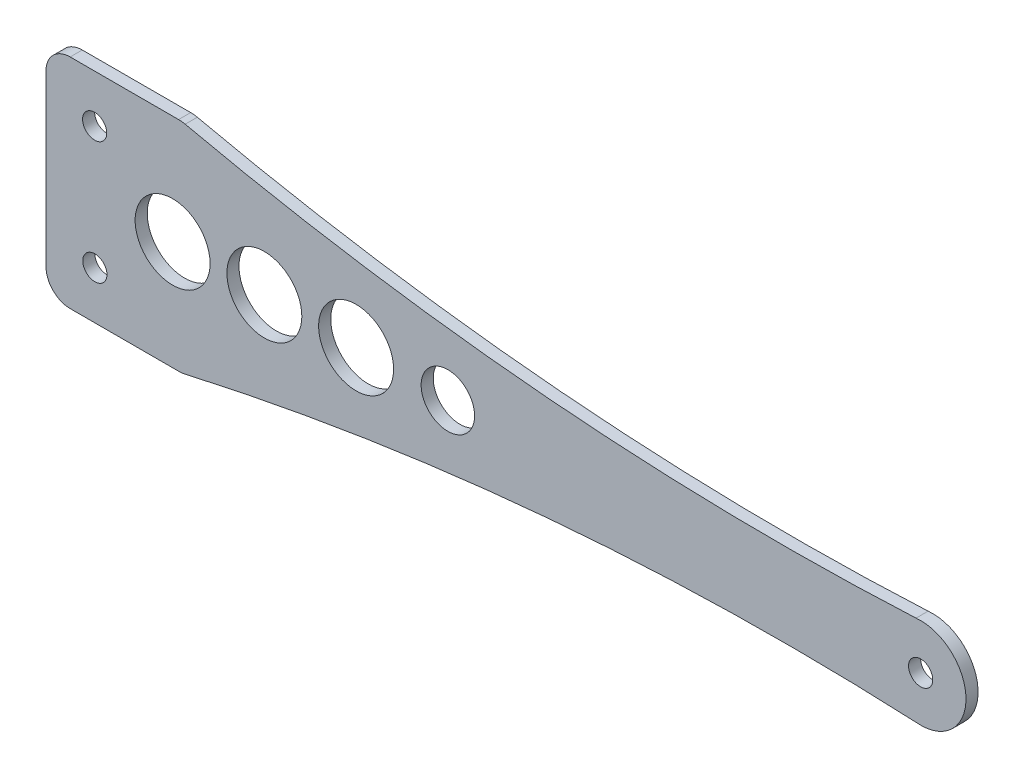
ISO-10303-21;
HEADER;
FILE_DESCRIPTION(('STEP AP214'),'2;1');
FILE_NAME('part.step','',(''),(''),'','','');
FILE_SCHEMA(('AUTOMOTIVE_DESIGN { 1 0 10303 214 1 1 1 1 }'));
ENDSEC;
DATA;
#1=APPLICATION_CONTEXT('core data for automotive mechanical design processes');
#2=APPLICATION_PROTOCOL_DEFINITION('international standard','automotive_design',2000,#1);
#3=PRODUCT_CONTEXT('',#1,'mechanical');
#4=PRODUCT('Part','Part','',(#3));
#5=PRODUCT_RELATED_PRODUCT_CATEGORY('part','',(#4));
#6=PRODUCT_DEFINITION_FORMATION('','',#4);
#7=PRODUCT_DEFINITION_CONTEXT('part definition',#1,'design');
#8=PRODUCT_DEFINITION('design','',#6,#7);
#9=PRODUCT_DEFINITION_SHAPE('','',#8);
#10=(LENGTH_UNIT() NAMED_UNIT(*) SI_UNIT(.MILLI.,.METRE.));
#11=(NAMED_UNIT(*) PLANE_ANGLE_UNIT() SI_UNIT($,.RADIAN.));
#12=(NAMED_UNIT(*) SI_UNIT($,.STERADIAN.) SOLID_ANGLE_UNIT());
#13=UNCERTAINTY_MEASURE_WITH_UNIT(LENGTH_MEASURE(1.E-05),#10,'distance_accuracy_value','');
#14=(GEOMETRIC_REPRESENTATION_CONTEXT(3) GLOBAL_UNCERTAINTY_ASSIGNED_CONTEXT((#13)) GLOBAL_UNIT_ASSIGNED_CONTEXT((#10,
#11,#12)) REPRESENTATION_CONTEXT('',''));
#15=CARTESIAN_POINT('',(0.,0.,0.));
#16=DIRECTION('',(0.,0.,1.));
#17=DIRECTION('',(1.,0.,0.));
#18=AXIS2_PLACEMENT_3D('',#15,#16,#17);
#19=CARTESIAN_POINT('',(2268.27785057398,1591.16171773863,2.));
#20=DIRECTION('',(0.,0.,1.));
#21=DIRECTION('',(1.,0.,0.));
#22=AXIS2_PLACEMENT_3D('',#19,#20,#21);
#23=PLANE('',#22);
#24=CARTESIAN_POINT('',(2315.57006356653,1577.17432215257,2.));
#25=DIRECTION('',(0.,0.,1.));
#26=DIRECTION('',(1.,0.,0.));
#27=AXIS2_PLACEMENT_3D('',#24,#25,#26);
#28=CIRCLE('',#27,6.19827488197444);
#29=CARTESIAN_POINT('',(2321.7683384485,1577.17432215257,2.));
#30=VERTEX_POINT('',#29);
#31=EDGE_CURVE('E235',#30,#30,#28,.T.);
#32=ORIENTED_EDGE('',*,*,#31,.F.);
#33=EDGE_LOOP('',(#32));
#34=FACE_BOUND('',#33,.T.);
#35=CARTESIAN_POINT('',(2285.21897073178,1577.14245303134,2.));
#36=DIRECTION('',(0.,0.,1.));
#37=DIRECTION('',(1.,0.,0.));
#38=AXIS2_PLACEMENT_3D('',#35,#36,#37);
#39=CIRCLE('',#38,6.19827488197444);
#40=CARTESIAN_POINT('',(2291.41724561376,1577.14245303134,2.));
#41=VERTEX_POINT('',#40);
#42=EDGE_CURVE('E223',#41,#41,#39,.T.);
#43=ORIENTED_EDGE('',*,*,#42,.F.);
#44=EDGE_LOOP('',(#43));
#45=FACE_BOUND('',#44,.T.);
#46=CARTESIAN_POINT('',(2408.94422753866,1577.27236648222,2.));
#47=DIRECTION('',(0.,0.,1.));
#48=DIRECTION('',(1.,0.,0.));
#49=AXIS2_PLACEMENT_3D('',#46,#47,#48);
#50=CIRCLE('',#49,1.99999999999978);
#51=CARTESIAN_POINT('',(2410.94422753866,1577.27236648222,2.));
#52=VERTEX_POINT('',#51);
#53=EDGE_CURVE('E211',#52,#52,#50,.T.);
#54=ORIENTED_EDGE('',*,*,#53,.F.);
#55=EDGE_LOOP('',(#54));
#56=FACE_BOUND('',#55,.T.);
#57=CARTESIAN_POINT('',(2268.27785057398,1591.16171773863,2.));
#58=DIRECTION('',(0.,0.,1.));
#59=DIRECTION('',(1.,0.,0.));
#60=AXIS2_PLACEMENT_3D('',#57,#58,#59);
#61=CIRCLE('',#60,4.00000000000023);
#62=CARTESIAN_POINT('',(2268.27785057398,1595.16171773863,2.));
#63=VERTEX_POINT('',#62);
#64=CARTESIAN_POINT('',(2264.27785057398,1591.16171773863,2.));
#65=VERTEX_POINT('',#64);
#66=EDGE_CURVE('E160',#63,#65,#61,.T.);
#67=ORIENTED_EDGE('',*,*,#66,.T.);
#68=DIRECTION('',(0.,-1.,0.));
#69=VECTOR('',#68,1.);
#70=CARTESIAN_POINT('',(2264.27785057398,1591.16171773863,2.));
#71=LINE('',#70,#69);
#72=CARTESIAN_POINT('',(2264.27785057398,1563.11291185545,2.));
#73=VERTEX_POINT('',#72);
#74=EDGE_CURVE('E98',#65,#73,#71,.T.);
#75=ORIENTED_EDGE('',*,*,#74,.T.);
#76=CARTESIAN_POINT('',(2268.27785057398,1563.11291185545,2.));
#77=DIRECTION('',(0.,0.,1.));
#78=DIRECTION('',(1.,0.,0.));
#79=AXIS2_PLACEMENT_3D('',#76,#77,#78);
#80=CIRCLE('',#79,4.);
#81=CARTESIAN_POINT('',(2268.27785057398,1559.11291185545,2.));
#82=VERTEX_POINT('',#81);
#83=EDGE_CURVE('E181',#73,#82,#80,.T.);
#84=ORIENTED_EDGE('',*,*,#83,.T.);
#85=DIRECTION('',(1.,0.,0.));
#86=VECTOR('',#85,1.);
#87=CARTESIAN_POINT('',(2268.27785057398,1559.11291185545,2.));
#88=LINE('',#87,#86);
#89=CARTESIAN_POINT('',(2286.18213001002,1559.11291185546,2.));
#90=VERTEX_POINT('',#89);
#91=EDGE_CURVE('E200',#82,#90,#88,.T.);
#92=ORIENTED_EDGE('',*,*,#91,.T.);
#93=CARTESIAN_POINT('',(2286.18213001002,1564.11291185546,2.));
#94=DIRECTION('',(0.,0.,1.));
#95=DIRECTION('',(1.,0.,0.));
#96=AXIS2_PLACEMENT_3D('',#93,#94,#95);
#97=CIRCLE('',#96,4.99999999999987);
#98=CARTESIAN_POINT('',(2287.28476918928,1559.23600844854,2.));
#99=VERTEX_POINT('',#98);
#100=EDGE_CURVE('E197',#90,#99,#97,.T.);
#101=ORIENTED_EDGE('',*,*,#100,.T.);
#102=CARTESIAN_POINT('',(2386.62657166681,1119.85349409846,2.));
#103=DIRECTION('',(0.,0.,-1.));
#104=DIRECTION('',(1.,0.,0.));
#105=AXIS2_PLACEMENT_3D('',#102,#103,#104);
#106=CIRCLE('',#105,450.472848944398);
#107=CARTESIAN_POINT('',(2408.19843558947,1569.80953897728,2.));
#108=VERTEX_POINT('',#107);
#109=EDGE_CURVE('E199',#99,#108,#106,.T.);
#110=ORIENTED_EDGE('',*,*,#109,.T.);
#111=CARTESIAN_POINT('',(2408.94422753866,1577.27236648222,2.));
#112=DIRECTION('',(0.,0.,1.));
#113=DIRECTION('',(1.,0.,0.));
#114=AXIS2_PLACEMENT_3D('',#111,#112,#113);
#115=CIRCLE('',#114,7.49999999999993);
#116=CARTESIAN_POINT('',(2408.18276508053,1584.73361134651,2.));
#117=VERTEX_POINT('',#116);
#118=EDGE_CURVE('E123',#108,#117,#115,.T.);
#119=ORIENTED_EDGE('',*,*,#118,.T.);
#120=CARTESIAN_POINT('',(2385.666028026,2034.64336250611,2.));
#121=DIRECTION('',(0.,0.,-1.));
#122=DIRECTION('',(1.,0.,0.));
#123=AXIS2_PLACEMENT_3D('',#120,#121,#122);
#124=CIRCLE('',#123,450.472848944398);
#125=CARTESIAN_POINT('',(2287.30138065483,1595.04106066543,2.));
#126=VERTEX_POINT('',#125);
#127=EDGE_CURVE('E117',#117,#126,#124,.T.);
#128=ORIENTED_EDGE('',*,*,#127,.T.);
#129=CARTESIAN_POINT('',(2286.20958735812,1590.16171773864,2.));
#130=DIRECTION('',(0.,0.,1.));
#131=DIRECTION('',(1.,0.,0.));
#132=AXIS2_PLACEMENT_3D('',#129,#130,#131);
#133=CIRCLE('',#132,4.99999999999987);
#134=CARTESIAN_POINT('',(2286.20958735812,1595.16171773864,2.));
#135=VERTEX_POINT('',#134);
#136=EDGE_CURVE('E121',#126,#135,#133,.T.);
#137=ORIENTED_EDGE('',*,*,#136,.T.);
#138=DIRECTION('',(-1.,0.,0.));
#139=VECTOR('',#138,1.);
#140=CARTESIAN_POINT('',(2268.27785057398,1595.16171773863,2.));
#141=LINE('',#140,#139);
#142=EDGE_CURVE('E49',#135,#63,#141,.T.);
#143=ORIENTED_EDGE('',*,*,#142,.T.);
#144=EDGE_LOOP('',(#67,#75,#84,#92,#101,#110,#119,#128,#137,#143));
#145=FACE_BOUND('',#144,.T.);
#146=CARTESIAN_POINT('',(2272.32548700573,1587.26517494694,2.));
#147=DIRECTION('',(0.,0.,1.));
#148=DIRECTION('',(1.,0.,0.));
#149=AXIS2_PLACEMENT_3D('',#146,#147,#148);
#150=CIRCLE('',#149,1.99999999999978);
#151=CARTESIAN_POINT('',(2274.32548700573,1587.26517494694,2.));
#152=VERTEX_POINT('',#151);
#153=EDGE_CURVE('E145',#152,#152,#150,.T.);
#154=ORIENTED_EDGE('',*,*,#153,.F.);
#155=EDGE_LOOP('',(#154));
#156=FACE_BOUND('',#155,.T.);
#157=CARTESIAN_POINT('',(2272.36052271664,1567.00968004048,2.));
#158=DIRECTION('',(0.,0.,1.));
#159=DIRECTION('',(1.,0.,0.));
#160=AXIS2_PLACEMENT_3D('',#157,#158,#159);
#161=CIRCLE('',#160,1.99999999999978);
#162=CARTESIAN_POINT('',(2274.36052271664,1567.00968004048,2.));
#163=VERTEX_POINT('',#162);
#164=EDGE_CURVE('E217',#163,#163,#161,.T.);
#165=ORIENTED_EDGE('',*,*,#164,.F.);
#166=EDGE_LOOP('',(#165));
#167=FACE_BOUND('',#166,.T.);
#168=CARTESIAN_POINT('',(2300.39451714915,1577.15838759195,2.));
#169=DIRECTION('',(0.,0.,1.));
#170=DIRECTION('',(1.,0.,0.));
#171=AXIS2_PLACEMENT_3D('',#168,#169,#170);
#172=CIRCLE('',#171,6.19827488197444);
#173=CARTESIAN_POINT('',(2306.59279203113,1577.15838759195,2.));
#174=VERTEX_POINT('',#173);
#175=EDGE_CURVE('E229',#174,#174,#172,.T.);
#176=ORIENTED_EDGE('',*,*,#175,.F.);
#177=EDGE_LOOP('',(#176));
#178=FACE_BOUND('',#177,.T.);
#179=CARTESIAN_POINT('',(2330.7456099839,1577.19025671318,2.));
#180=DIRECTION('',(0.,0.,1.));
#181=DIRECTION('',(1.,0.,0.));
#182=AXIS2_PLACEMENT_3D('',#179,#180,#181);
#183=CIRCLE('',#182,4.41971780266748);
#184=CARTESIAN_POINT('',(2335.16532778656,1577.19025671318,2.));
#185=VERTEX_POINT('',#184);
#186=EDGE_CURVE('E241',#185,#185,#183,.T.);
#187=ORIENTED_EDGE('',*,*,#186,.F.);
#188=EDGE_LOOP('',(#187));
#189=FACE_BOUND('',#188,.T.);
#190=ADVANCED_FACE('F32',(#34,#45,#56,#145,#156,#167,#178,#189),#23,.T.);
#191=CARTESIAN_POINT('',(2268.27785057398,1591.16171773863,0.));
#192=DIRECTION('',(0.,0.,1.));
#193=DIRECTION('',(1.,0.,0.));
#194=AXIS2_PLACEMENT_3D('',#191,#192,#193);
#195=PLANE('',#194);
#196=CARTESIAN_POINT('',(2315.57006356653,1577.17432215257,0.));
#197=DIRECTION('',(0.,0.,1.));
#198=DIRECTION('',(1.,0.,0.));
#199=AXIS2_PLACEMENT_3D('',#196,#197,#198);
#200=CIRCLE('',#199,6.19827488197444);
#201=CARTESIAN_POINT('',(2321.7683384485,1577.17432215257,0.));
#202=VERTEX_POINT('',#201);
#203=EDGE_CURVE('E238',#202,#202,#200,.T.);
#204=ORIENTED_EDGE('',*,*,#203,.T.);
#205=EDGE_LOOP('',(#204));
#206=FACE_BOUND('',#205,.T.);
#207=CARTESIAN_POINT('',(2285.21897073178,1577.14245303134,0.));
#208=DIRECTION('',(0.,0.,1.));
#209=DIRECTION('',(1.,0.,0.));
#210=AXIS2_PLACEMENT_3D('',#207,#208,#209);
#211=CIRCLE('',#210,6.19827488197444);
#212=CARTESIAN_POINT('',(2291.41724561376,1577.14245303134,0.));
#213=VERTEX_POINT('',#212);
#214=EDGE_CURVE('E226',#213,#213,#211,.T.);
#215=ORIENTED_EDGE('',*,*,#214,.T.);
#216=EDGE_LOOP('',(#215));
#217=FACE_BOUND('',#216,.T.);
#218=CARTESIAN_POINT('',(2408.94422753866,1577.27236648222,0.));
#219=DIRECTION('',(0.,0.,1.));
#220=DIRECTION('',(1.,0.,0.));
#221=AXIS2_PLACEMENT_3D('',#218,#219,#220);
#222=CIRCLE('',#221,1.99999999999978);
#223=CARTESIAN_POINT('',(2410.94422753866,1577.27236648222,0.));
#224=VERTEX_POINT('',#223);
#225=EDGE_CURVE('E214',#224,#224,#222,.T.);
#226=ORIENTED_EDGE('',*,*,#225,.T.);
#227=EDGE_LOOP('',(#226));
#228=FACE_BOUND('',#227,.T.);
#229=CARTESIAN_POINT('',(2268.27785057398,1591.16171773863,0.));
#230=DIRECTION('',(0.,0.,1.));
#231=DIRECTION('',(1.,0.,0.));
#232=AXIS2_PLACEMENT_3D('',#229,#230,#231);
#233=CIRCLE('',#232,4.00000000000023);
#234=CARTESIAN_POINT('',(2268.27785057398,1595.16171773863,0.));
#235=VERTEX_POINT('',#234);
#236=CARTESIAN_POINT('',(2264.27785057398,1591.16171773863,0.));
#237=VERTEX_POINT('',#236);
#238=EDGE_CURVE('E141',#235,#237,#233,.T.);
#239=ORIENTED_EDGE('',*,*,#238,.F.);
#240=DIRECTION('',(-1.,0.,0.));
#241=VECTOR('',#240,1.);
#242=CARTESIAN_POINT('',(2268.27785057398,1595.16171773863,0.));
#243=LINE('',#242,#241);
#244=CARTESIAN_POINT('',(2286.20958735812,1595.16171773864,0.));
#245=VERTEX_POINT('',#244);
#246=EDGE_CURVE('E90',#245,#235,#243,.T.);
#247=ORIENTED_EDGE('',*,*,#246,.F.);
#248=CARTESIAN_POINT('',(2286.20958735812,1590.16171773864,0.));
#249=DIRECTION('',(0.,0.,1.));
#250=DIRECTION('',(1.,0.,0.));
#251=AXIS2_PLACEMENT_3D('',#248,#249,#250);
#252=CIRCLE('',#251,4.99999999999987);
#253=CARTESIAN_POINT('',(2287.30138065483,1595.04106066543,0.));
#254=VERTEX_POINT('',#253);
#255=EDGE_CURVE('E84',#254,#245,#252,.T.);
#256=ORIENTED_EDGE('',*,*,#255,.F.);
#257=CARTESIAN_POINT('',(2385.666028026,2034.64336250611,0.));
#258=DIRECTION('',(0.,0.,-1.));
#259=DIRECTION('',(1.,0.,0.));
#260=AXIS2_PLACEMENT_3D('',#257,#258,#259);
#261=CIRCLE('',#260,450.472848944398);
#262=CARTESIAN_POINT('',(2408.18276508053,1584.73361134651,0.));
#263=VERTEX_POINT('',#262);
#264=EDGE_CURVE('E131',#263,#254,#261,.T.);
#265=ORIENTED_EDGE('',*,*,#264,.F.);
#266=CARTESIAN_POINT('',(2408.94422753866,1577.27236648222,0.));
#267=DIRECTION('',(0.,0.,1.));
#268=DIRECTION('',(1.,0.,0.));
#269=AXIS2_PLACEMENT_3D('',#266,#267,#268);
#270=CIRCLE('',#269,7.49999999999993);
#271=CARTESIAN_POINT('',(2408.19843558947,1569.80953897728,0.));
#272=VERTEX_POINT('',#271);
#273=EDGE_CURVE('E155',#272,#263,#270,.T.);
#274=ORIENTED_EDGE('',*,*,#273,.F.);
#275=CARTESIAN_POINT('',(2386.62657166681,1119.85349409846,0.));
#276=DIRECTION('',(0.,0.,-1.));
#277=DIRECTION('',(1.,0.,0.));
#278=AXIS2_PLACEMENT_3D('',#275,#276,#277);
#279=CIRCLE('',#278,450.472848944398);
#280=CARTESIAN_POINT('',(2287.28476918928,1559.23600844854,0.));
#281=VERTEX_POINT('',#280);
#282=EDGE_CURVE('E153',#281,#272,#279,.T.);
#283=ORIENTED_EDGE('',*,*,#282,.F.);
#284=CARTESIAN_POINT('',(2286.18213001002,1564.11291185546,0.));
#285=DIRECTION('',(0.,0.,1.));
#286=DIRECTION('',(1.,0.,0.));
#287=AXIS2_PLACEMENT_3D('',#284,#285,#286);
#288=CIRCLE('',#287,4.99999999999987);
#289=CARTESIAN_POINT('',(2286.18213001002,1559.11291185546,0.));
#290=VERTEX_POINT('',#289);
#291=EDGE_CURVE('E151',#290,#281,#288,.T.);
#292=ORIENTED_EDGE('',*,*,#291,.F.);
#293=DIRECTION('',(1.,0.,0.));
#294=VECTOR('',#293,1.);
#295=CARTESIAN_POINT('',(2268.27785057398,1559.11291185545,0.));
#296=LINE('',#295,#294);
#297=CARTESIAN_POINT('',(2268.27785057398,1559.11291185545,0.));
#298=VERTEX_POINT('',#297);
#299=EDGE_CURVE('E149',#298,#290,#296,.T.);
#300=ORIENTED_EDGE('',*,*,#299,.F.);
#301=CARTESIAN_POINT('',(2268.27785057398,1563.11291185545,0.));
#302=DIRECTION('',(0.,0.,1.));
#303=DIRECTION('',(1.,0.,0.));
#304=AXIS2_PLACEMENT_3D('',#301,#302,#303);
#305=CIRCLE('',#304,4.);
#306=CARTESIAN_POINT('',(2264.27785057398,1563.11291185545,0.));
#307=VERTEX_POINT('',#306);
#308=EDGE_CURVE('E147',#307,#298,#305,.T.);
#309=ORIENTED_EDGE('',*,*,#308,.F.);
#310=DIRECTION('',(0.,-1.,0.));
#311=VECTOR('',#310,1.);
#312=CARTESIAN_POINT('',(2264.27785057398,1591.16171773863,0.));
#313=LINE('',#312,#311);
#314=EDGE_CURVE('E144',#237,#307,#313,.T.);
#315=ORIENTED_EDGE('',*,*,#314,.F.);
#316=EDGE_LOOP('',(#239,#247,#256,#265,#274,#283,#292,#300,#309,#315));
#317=FACE_BOUND('',#316,.T.);
#318=CARTESIAN_POINT('',(2272.32548700573,1587.26517494694,0.));
#319=DIRECTION('',(0.,0.,1.));
#320=DIRECTION('',(1.,0.,0.));
#321=AXIS2_PLACEMENT_3D('',#318,#319,#320);
#322=CIRCLE('',#321,1.99999999999978);
#323=CARTESIAN_POINT('',(2274.32548700573,1587.26517494694,0.));
#324=VERTEX_POINT('',#323);
#325=EDGE_CURVE('E208',#324,#324,#322,.T.);
#326=ORIENTED_EDGE('',*,*,#325,.T.);
#327=EDGE_LOOP('',(#326));
#328=FACE_BOUND('',#327,.T.);
#329=CARTESIAN_POINT('',(2272.36052271664,1567.00968004048,0.));
#330=DIRECTION('',(0.,0.,1.));
#331=DIRECTION('',(1.,0.,0.));
#332=AXIS2_PLACEMENT_3D('',#329,#330,#331);
#333=CIRCLE('',#332,1.99999999999978);
#334=CARTESIAN_POINT('',(2274.36052271664,1567.00968004048,0.));
#335=VERTEX_POINT('',#334);
#336=EDGE_CURVE('E220',#335,#335,#333,.T.);
#337=ORIENTED_EDGE('',*,*,#336,.T.);
#338=EDGE_LOOP('',(#337));
#339=FACE_BOUND('',#338,.T.);
#340=CARTESIAN_POINT('',(2300.39451714915,1577.15838759195,0.));
#341=DIRECTION('',(0.,0.,1.));
#342=DIRECTION('',(1.,0.,0.));
#343=AXIS2_PLACEMENT_3D('',#340,#341,#342);
#344=CIRCLE('',#343,6.19827488197444);
#345=CARTESIAN_POINT('',(2306.59279203113,1577.15838759195,0.));
#346=VERTEX_POINT('',#345);
#347=EDGE_CURVE('E232',#346,#346,#344,.T.);
#348=ORIENTED_EDGE('',*,*,#347,.T.);
#349=EDGE_LOOP('',(#348));
#350=FACE_BOUND('',#349,.T.);
#351=CARTESIAN_POINT('',(2330.7456099839,1577.19025671318,0.));
#352=DIRECTION('',(0.,0.,1.));
#353=DIRECTION('',(1.,0.,0.));
#354=AXIS2_PLACEMENT_3D('',#351,#352,#353);
#355=CIRCLE('',#354,4.41971780266748);
#356=CARTESIAN_POINT('',(2335.16532778656,1577.19025671318,0.));
#357=VERTEX_POINT('',#356);
#358=EDGE_CURVE('E244',#357,#357,#355,.T.);
#359=ORIENTED_EDGE('',*,*,#358,.T.);
#360=EDGE_LOOP('',(#359));
#361=FACE_BOUND('',#360,.T.);
#362=ADVANCED_FACE('F185',(#206,#217,#228,#317,#328,#339,#350,#361),#195,.F.);
#363=CARTESIAN_POINT('',(2268.27785057398,1591.16171773863,2.));
#364=DIRECTION('',(0.,0.,-1.));
#365=DIRECTION('',(-1.,0.,0.));
#366=AXIS2_PLACEMENT_3D('',#363,#364,#365);
#367=CYLINDRICAL_SURFACE('',#366,4.00000000000023);
#368=ORIENTED_EDGE('',*,*,#238,.T.);
#369=DIRECTION('',(0.,0.,-1.));
#370=VECTOR('',#369,1.);
#371=CARTESIAN_POINT('',(2264.27785057398,1591.16171773863,2.));
#372=LINE('',#371,#370);
#373=EDGE_CURVE('E11',#65,#237,#372,.T.);
#374=ORIENTED_EDGE('',*,*,#373,.F.);
#375=ORIENTED_EDGE('',*,*,#66,.F.);
#376=DIRECTION('',(0.,0.,-1.));
#377=VECTOR('',#376,1.);
#378=CARTESIAN_POINT('',(2268.27785057398,1595.16171773863,2.));
#379=LINE('',#378,#377);
#380=EDGE_CURVE('E137',#63,#235,#379,.T.);
#381=ORIENTED_EDGE('',*,*,#380,.T.);
#382=EDGE_LOOP('',(#368,#374,#375,#381));
#383=FACE_BOUND('',#382,.T.);
#384=ADVANCED_FACE('F34',(#383),#367,.T.);
#385=CARTESIAN_POINT('',(2264.27785057398,1591.16171773863,2.));
#386=DIRECTION('',(1.,0.,0.));
#387=DIRECTION('',(0.,1.,0.));
#388=AXIS2_PLACEMENT_3D('',#385,#386,#387);
#389=PLANE('',#388);
#390=ORIENTED_EDGE('',*,*,#314,.T.);
#391=DIRECTION('',(0.,0.,-1.));
#392=VECTOR('',#391,1.);
#393=CARTESIAN_POINT('',(2264.27785057398,1563.11291185545,2.));
#394=LINE('',#393,#392);
#395=EDGE_CURVE('E41',#73,#307,#394,.T.);
#396=ORIENTED_EDGE('',*,*,#395,.F.);
#397=ORIENTED_EDGE('',*,*,#74,.F.);
#398=ORIENTED_EDGE('',*,*,#373,.T.);
#399=EDGE_LOOP('',(#390,#396,#397,#398));
#400=FACE_BOUND('',#399,.T.);
#401=ADVANCED_FACE('F287',(#400),#389,.F.);
#402=CARTESIAN_POINT('',(2268.27785057398,1563.11291185545,2.));
#403=DIRECTION('',(0.,0.,-1.));
#404=DIRECTION('',(-1.,0.,0.));
#405=AXIS2_PLACEMENT_3D('',#402,#403,#404);
#406=CYLINDRICAL_SURFACE('',#405,4.);
#407=ORIENTED_EDGE('',*,*,#308,.T.);
#408=DIRECTION('',(0.,0.,-1.));
#409=VECTOR('',#408,1.);
#410=CARTESIAN_POINT('',(2268.27785057398,1559.11291185545,2.));
#411=LINE('',#410,#409);
#412=EDGE_CURVE('E173',#82,#298,#411,.T.);
#413=ORIENTED_EDGE('',*,*,#412,.F.);
#414=ORIENTED_EDGE('',*,*,#83,.F.);
#415=ORIENTED_EDGE('',*,*,#395,.T.);
#416=EDGE_LOOP('',(#407,#413,#414,#415));
#417=FACE_BOUND('',#416,.T.);
#418=ADVANCED_FACE('F179',(#417),#406,.T.);
#419=CARTESIAN_POINT('',(2268.27785057398,1559.11291185545,2.));
#420=DIRECTION('',(0.,1.,0.));
#421=DIRECTION('',(-1.,0.,0.));
#422=AXIS2_PLACEMENT_3D('',#419,#420,#421);
#423=PLANE('',#422);
#424=ORIENTED_EDGE('',*,*,#299,.T.);
#425=DIRECTION('',(0.,0.,-1.));
#426=VECTOR('',#425,1.);
#427=CARTESIAN_POINT('',(2286.18213001002,1559.11291185546,2.));
#428=LINE('',#427,#426);
#429=EDGE_CURVE('E170',#90,#290,#428,.T.);
#430=ORIENTED_EDGE('',*,*,#429,.F.);
#431=ORIENTED_EDGE('',*,*,#91,.F.);
#432=ORIENTED_EDGE('',*,*,#412,.T.);
#433=EDGE_LOOP('',(#424,#430,#431,#432));
#434=FACE_BOUND('',#433,.T.);
#435=ADVANCED_FACE('F191',(#434),#423,.F.);
#436=CARTESIAN_POINT('',(2286.18213001002,1564.11291185546,2.));
#437=DIRECTION('',(0.,0.,-1.));
#438=DIRECTION('',(-1.,0.,0.));
#439=AXIS2_PLACEMENT_3D('',#436,#437,#438);
#440=CYLINDRICAL_SURFACE('',#439,4.99999999999987);
#441=ORIENTED_EDGE('',*,*,#291,.T.);
#442=DIRECTION('',(0.,0.,-1.));
#443=VECTOR('',#442,1.);
#444=CARTESIAN_POINT('',(2287.28476918928,1559.23600844854,2.));
#445=LINE('',#444,#443);
#446=EDGE_CURVE('E167',#99,#281,#445,.T.);
#447=ORIENTED_EDGE('',*,*,#446,.F.);
#448=ORIENTED_EDGE('',*,*,#100,.F.);
#449=ORIENTED_EDGE('',*,*,#429,.T.);
#450=EDGE_LOOP('',(#441,#447,#448,#449));
#451=FACE_BOUND('',#450,.T.);
#452=ADVANCED_FACE('F195',(#451),#440,.T.);
#453=CARTESIAN_POINT('',(2386.62657166681,1119.85349409846,2.));
#454=DIRECTION('',(0.,0.,-1.));
#455=DIRECTION('',(-1.,0.,0.));
#456=AXIS2_PLACEMENT_3D('',#453,#454,#455);
#457=CYLINDRICAL_SURFACE('',#456,450.472848944398);
#458=ORIENTED_EDGE('',*,*,#282,.T.);
#459=DIRECTION('',(0.,0.,-1.));
#460=VECTOR('',#459,1.);
#461=CARTESIAN_POINT('',(2408.19843558947,1569.80953897728,2.));
#462=LINE('',#461,#460);
#463=EDGE_CURVE('E164',#108,#272,#462,.T.);
#464=ORIENTED_EDGE('',*,*,#463,.F.);
#465=ORIENTED_EDGE('',*,*,#109,.F.);
#466=ORIENTED_EDGE('',*,*,#446,.T.);
#467=EDGE_LOOP('',(#458,#464,#465,#466));
#468=FACE_BOUND('',#467,.T.);
#469=ADVANCED_FACE('F277',(#468),#457,.F.);
#470=CARTESIAN_POINT('',(2408.94422753866,1577.27236648222,2.));
#471=DIRECTION('',(0.,0.,-1.));
#472=DIRECTION('',(-1.,0.,0.));
#473=AXIS2_PLACEMENT_3D('',#470,#471,#472);
#474=CYLINDRICAL_SURFACE('',#473,7.49999999999993);
#475=ORIENTED_EDGE('',*,*,#273,.T.);
#476=DIRECTION('',(0.,0.,-1.));
#477=VECTOR('',#476,1.);
#478=CARTESIAN_POINT('',(2408.18276508053,1584.73361134651,2.));
#479=LINE('',#478,#477);
#480=EDGE_CURVE('E132',#117,#263,#479,.T.);
#481=ORIENTED_EDGE('',*,*,#480,.F.);
#482=ORIENTED_EDGE('',*,*,#118,.F.);
#483=ORIENTED_EDGE('',*,*,#463,.T.);
#484=EDGE_LOOP('',(#475,#481,#482,#483));
#485=FACE_BOUND('',#484,.T.);
#486=ADVANCED_FACE('F274',(#485),#474,.T.);
#487=CARTESIAN_POINT('',(2385.666028026,2034.64336250611,2.));
#488=DIRECTION('',(0.,0.,-1.));
#489=DIRECTION('',(-1.,0.,0.));
#490=AXIS2_PLACEMENT_3D('',#487,#488,#489);
#491=CYLINDRICAL_SURFACE('',#490,450.472848944398);
#492=ORIENTED_EDGE('',*,*,#264,.T.);
#493=DIRECTION('',(0.,0.,-1.));
#494=VECTOR('',#493,1.);
#495=CARTESIAN_POINT('',(2287.30138065483,1595.04106066543,2.));
#496=LINE('',#495,#494);
#497=EDGE_CURVE('E128',#126,#254,#496,.T.);
#498=ORIENTED_EDGE('',*,*,#497,.F.);
#499=ORIENTED_EDGE('',*,*,#127,.F.);
#500=ORIENTED_EDGE('',*,*,#480,.T.);
#501=EDGE_LOOP('',(#492,#498,#499,#500));
#502=FACE_BOUND('',#501,.T.);
#503=ADVANCED_FACE('F129',(#502),#491,.F.);
#504=CARTESIAN_POINT('',(2286.20958735812,1590.16171773864,2.));
#505=DIRECTION('',(0.,0.,-1.));
#506=DIRECTION('',(-1.,0.,0.));
#507=AXIS2_PLACEMENT_3D('',#504,#505,#506);
#508=CYLINDRICAL_SURFACE('',#507,4.99999999999987);
#509=ORIENTED_EDGE('',*,*,#255,.T.);
#510=DIRECTION('',(0.,0.,-1.));
#511=VECTOR('',#510,1.);
#512=CARTESIAN_POINT('',(2286.20958735812,1595.16171773864,2.));
#513=LINE('',#512,#511);
#514=EDGE_CURVE('E133',#135,#245,#513,.T.);
#515=ORIENTED_EDGE('',*,*,#514,.F.);
#516=ORIENTED_EDGE('',*,*,#136,.F.);
#517=ORIENTED_EDGE('',*,*,#497,.T.);
#518=EDGE_LOOP('',(#509,#515,#516,#517));
#519=FACE_BOUND('',#518,.T.);
#520=ADVANCED_FACE('F135',(#519),#508,.T.);
#521=CARTESIAN_POINT('',(2268.27785057398,1595.16171773863,2.));
#522=DIRECTION('',(0.,-1.,0.));
#523=DIRECTION('',(1.,0.,0.));
#524=AXIS2_PLACEMENT_3D('',#521,#522,#523);
#525=PLANE('',#524);
#526=ORIENTED_EDGE('',*,*,#246,.T.);
#527=ORIENTED_EDGE('',*,*,#380,.F.);
#528=ORIENTED_EDGE('',*,*,#142,.F.);
#529=ORIENTED_EDGE('',*,*,#514,.T.);
#530=EDGE_LOOP('',(#526,#527,#528,#529));
#531=FACE_BOUND('',#530,.T.);
#532=ADVANCED_FACE('F267',(#531),#525,.F.);
#533=CARTESIAN_POINT('',(2272.32548700573,1587.26517494694,2.));
#534=DIRECTION('',(0.,0.,-1.));
#535=DIRECTION('',(-1.,0.,0.));
#536=AXIS2_PLACEMENT_3D('',#533,#534,#535);
#537=CYLINDRICAL_SURFACE('',#536,1.99999999999978);
#538=ORIENTED_EDGE('',*,*,#153,.T.);
#539=EDGE_LOOP('',(#538));
#540=FACE_BOUND('',#539,.T.);
#541=ORIENTED_EDGE('',*,*,#325,.F.);
#542=EDGE_LOOP('',(#541));
#543=FACE_BOUND('',#542,.T.);
#544=ADVANCED_FACE('F264',(#540,#543),#537,.F.);
#545=CARTESIAN_POINT('',(2408.94422753866,1577.27236648222,2.));
#546=DIRECTION('',(0.,0.,-1.));
#547=DIRECTION('',(-1.,0.,0.));
#548=AXIS2_PLACEMENT_3D('',#545,#546,#547);
#549=CYLINDRICAL_SURFACE('',#548,1.99999999999978);
#550=ORIENTED_EDGE('',*,*,#53,.T.);
#551=EDGE_LOOP('',(#550));
#552=FACE_BOUND('',#551,.T.);
#553=ORIENTED_EDGE('',*,*,#225,.F.);
#554=EDGE_LOOP('',(#553));
#555=FACE_BOUND('',#554,.T.);
#556=ADVANCED_FACE('F363',(#552,#555),#549,.F.);
#557=CARTESIAN_POINT('',(2272.36052271664,1567.00968004048,2.));
#558=DIRECTION('',(0.,0.,-1.));
#559=DIRECTION('',(-1.,0.,0.));
#560=AXIS2_PLACEMENT_3D('',#557,#558,#559);
#561=CYLINDRICAL_SURFACE('',#560,1.99999999999978);
#562=ORIENTED_EDGE('',*,*,#164,.T.);
#563=EDGE_LOOP('',(#562));
#564=FACE_BOUND('',#563,.T.);
#565=ORIENTED_EDGE('',*,*,#336,.F.);
#566=EDGE_LOOP('',(#565));
#567=FACE_BOUND('',#566,.T.);
#568=ADVANCED_FACE('F371',(#564,#567),#561,.F.);
#569=CARTESIAN_POINT('',(2285.21897073178,1577.14245303134,2.));
#570=DIRECTION('',(0.,0.,-1.));
#571=DIRECTION('',(-1.,0.,0.));
#572=AXIS2_PLACEMENT_3D('',#569,#570,#571);
#573=CYLINDRICAL_SURFACE('',#572,6.19827488197444);
#574=ORIENTED_EDGE('',*,*,#42,.T.);
#575=EDGE_LOOP('',(#574));
#576=FACE_BOUND('',#575,.T.);
#577=ORIENTED_EDGE('',*,*,#214,.F.);
#578=EDGE_LOOP('',(#577));
#579=FACE_BOUND('',#578,.T.);
#580=ADVANCED_FACE('F379',(#576,#579),#573,.F.);
#581=CARTESIAN_POINT('',(2300.39451714915,1577.15838759195,2.));
#582=DIRECTION('',(0.,0.,-1.));
#583=DIRECTION('',(-1.,0.,0.));
#584=AXIS2_PLACEMENT_3D('',#581,#582,#583);
#585=CYLINDRICAL_SURFACE('',#584,6.19827488197444);
#586=ORIENTED_EDGE('',*,*,#175,.T.);
#587=EDGE_LOOP('',(#586));
#588=FACE_BOUND('',#587,.T.);
#589=ORIENTED_EDGE('',*,*,#347,.F.);
#590=EDGE_LOOP('',(#589));
#591=FACE_BOUND('',#590,.T.);
#592=ADVANCED_FACE('F388',(#588,#591),#585,.F.);
#593=CARTESIAN_POINT('',(2315.57006356653,1577.17432215257,2.));
#594=DIRECTION('',(0.,0.,-1.));
#595=DIRECTION('',(-1.,0.,0.));
#596=AXIS2_PLACEMENT_3D('',#593,#594,#595);
#597=CYLINDRICAL_SURFACE('',#596,6.19827488197444);
#598=ORIENTED_EDGE('',*,*,#31,.T.);
#599=EDGE_LOOP('',(#598));
#600=FACE_BOUND('',#599,.T.);
#601=ORIENTED_EDGE('',*,*,#203,.F.);
#602=EDGE_LOOP('',(#601));
#603=FACE_BOUND('',#602,.T.);
#604=ADVANCED_FACE('F397',(#600,#603),#597,.F.);
#605=CARTESIAN_POINT('',(2330.7456099839,1577.19025671318,2.));
#606=DIRECTION('',(0.,0.,-1.));
#607=DIRECTION('',(-1.,0.,0.));
#608=AXIS2_PLACEMENT_3D('',#605,#606,#607);
#609=CYLINDRICAL_SURFACE('',#608,4.41971780266748);
#610=ORIENTED_EDGE('',*,*,#186,.T.);
#611=EDGE_LOOP('',(#610));
#612=FACE_BOUND('',#611,.T.);
#613=ORIENTED_EDGE('',*,*,#358,.F.);
#614=EDGE_LOOP('',(#613));
#615=FACE_BOUND('',#614,.T.);
#616=ADVANCED_FACE('F250',(#612,#615),#609,.F.);
#617=CLOSED_SHELL('',(#190,#362,#384,#401,#418,#435,#452,#469,#486,#503,#520,#532,#544,#556,
#568,#580,#592,#604,#616));
#618=MANIFOLD_SOLID_BREP('B2',#617);
#619=ADVANCED_BREP_SHAPE_REPRESENTATION('',(#18,#618),#14);
#620=SHAPE_DEFINITION_REPRESENTATION(#9,#619);
ENDSEC;
END-ISO-10303-21;
